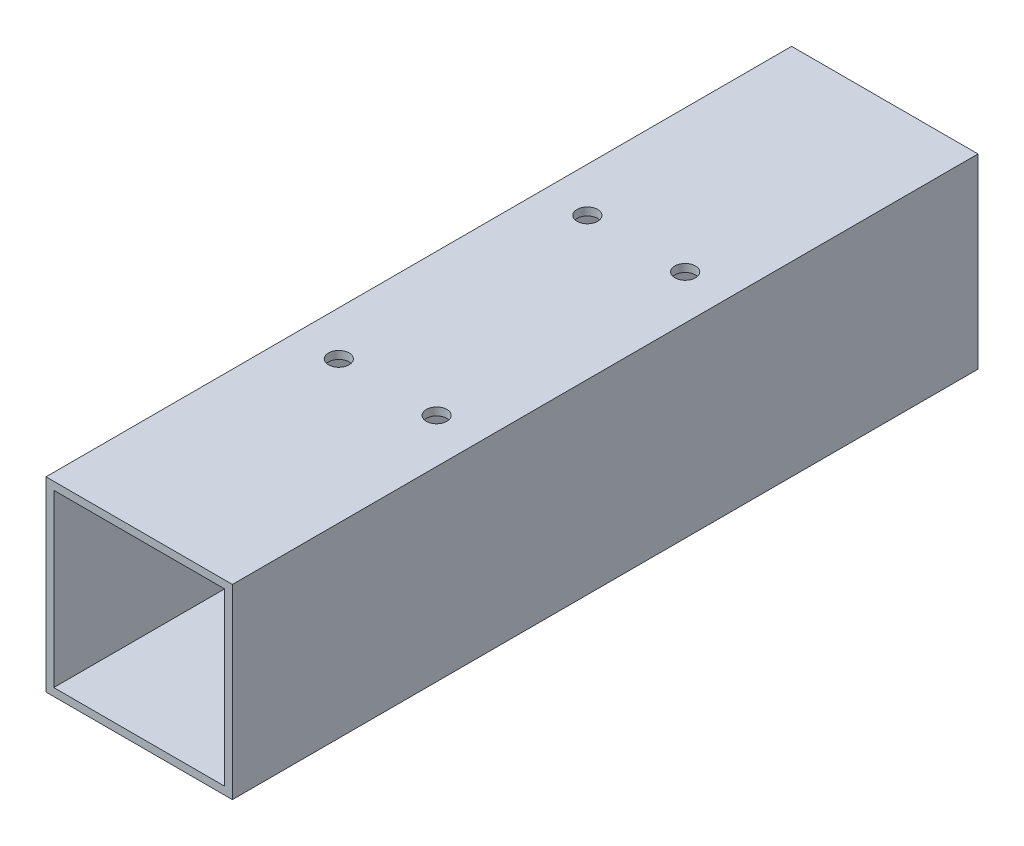
ISO-10303-21;
HEADER;
FILE_DESCRIPTION(('STEP AP214'),'2;1');
FILE_NAME('part.step','',(''),(''),'','','');
FILE_SCHEMA(('AUTOMOTIVE_DESIGN { 1 0 10303 214 1 1 1 1 }'));
ENDSEC;
DATA;
#1=APPLICATION_CONTEXT('core data for automotive mechanical design processes');
#2=APPLICATION_PROTOCOL_DEFINITION('international standard','automotive_design',2000,#1);
#3=PRODUCT_CONTEXT('',#1,'mechanical');
#4=PRODUCT('Part','Part','',(#3));
#5=PRODUCT_RELATED_PRODUCT_CATEGORY('part','',(#4));
#6=PRODUCT_DEFINITION_FORMATION('','',#4);
#7=PRODUCT_DEFINITION_CONTEXT('part definition',#1,'design');
#8=PRODUCT_DEFINITION('design','',#6,#7);
#9=PRODUCT_DEFINITION_SHAPE('','',#8);
#10=(LENGTH_UNIT() NAMED_UNIT(*) SI_UNIT(.MILLI.,.METRE.));
#11=(NAMED_UNIT(*) PLANE_ANGLE_UNIT() SI_UNIT($,.RADIAN.));
#12=(NAMED_UNIT(*) SI_UNIT($,.STERADIAN.) SOLID_ANGLE_UNIT());
#13=UNCERTAINTY_MEASURE_WITH_UNIT(LENGTH_MEASURE(1.E-05),#10,'distance_accuracy_value','');
#14=(GEOMETRIC_REPRESENTATION_CONTEXT(3) GLOBAL_UNCERTAINTY_ASSIGNED_CONTEXT((#13)) GLOBAL_UNIT_ASSIGNED_CONTEXT((#10,
#11,#12)) REPRESENTATION_CONTEXT('',''));
#15=CARTESIAN_POINT('',(0.,0.,0.));
#16=DIRECTION('',(0.,0.,1.));
#17=DIRECTION('',(1.,0.,0.));
#18=AXIS2_PLACEMENT_3D('',#15,#16,#17);
#19=CARTESIAN_POINT('',(-34.925,-34.925,152.4));
#20=DIRECTION('',(0.,1.,0.));
#21=DIRECTION('',(-1.,0.,0.));
#22=AXIS2_PLACEMENT_3D('',#19,#20,#21);
#23=PLANE('',#22);
#24=CARTESIAN_POINT('',(-20.,-34.925,-50.8));
#25=DIRECTION('',(0.,1.,0.));
#26=DIRECTION('',(-1.,0.,0.));
#27=AXIS2_PLACEMENT_3D('',#24,#25,#26);
#28=CIRCLE('',#27,6.74623999999999);
#29=CARTESIAN_POINT('',(-26.74624,-34.925,-50.8));
#30=VERTEX_POINT('',#29);
#31=EDGE_CURVE('E204',#30,#30,#28,.F.);
#32=ORIENTED_EDGE('',*,*,#31,.T.);
#33=EDGE_LOOP('',(#32));
#34=FACE_BOUND('',#33,.T.);
#35=CARTESIAN_POINT('',(20.,-34.925,50.8));
#36=DIRECTION('',(0.,1.,0.));
#37=DIRECTION('',(-1.,0.,0.));
#38=AXIS2_PLACEMENT_3D('',#35,#36,#37);
#39=CIRCLE('',#38,6.74623999999999);
#40=CARTESIAN_POINT('',(13.25376,-34.925,50.8));
#41=VERTEX_POINT('',#40);
#42=EDGE_CURVE('E198',#41,#41,#39,.F.);
#43=ORIENTED_EDGE('',*,*,#42,.T.);
#44=EDGE_LOOP('',(#43));
#45=FACE_BOUND('',#44,.T.);
#46=CARTESIAN_POINT('',(-20.,-34.925,50.8));
#47=DIRECTION('',(0.,1.,0.));
#48=DIRECTION('',(-1.,0.,0.));
#49=AXIS2_PLACEMENT_3D('',#46,#47,#48);
#50=CIRCLE('',#49,6.74623999999999);
#51=CARTESIAN_POINT('',(-26.74624,-34.925,50.8));
#52=VERTEX_POINT('',#51);
#53=EDGE_CURVE('E192',#52,#52,#50,.F.);
#54=ORIENTED_EDGE('',*,*,#53,.T.);
#55=EDGE_LOOP('',(#54));
#56=FACE_BOUND('',#55,.T.);
#57=DIRECTION('',(0.,0.,-1.));
#58=VECTOR('',#57,1.);
#59=CARTESIAN_POINT('',(34.9250000000001,-34.925,152.4));
#60=LINE('',#59,#58);
#61=CARTESIAN_POINT('',(34.9250000000001,-34.925,152.4));
#62=VERTEX_POINT('',#61);
#63=CARTESIAN_POINT('',(34.9250000000001,-34.925,-152.4));
#64=VERTEX_POINT('',#63);
#65=EDGE_CURVE('E116',#62,#64,#60,.T.);
#66=ORIENTED_EDGE('',*,*,#65,.T.);
#67=DIRECTION('',(1.,0.,0.));
#68=VECTOR('',#67,1.);
#69=CARTESIAN_POINT('',(-34.925,-34.925,-152.4));
#70=LINE('',#69,#68);
#71=CARTESIAN_POINT('',(-34.925,-34.925,-152.4));
#72=VERTEX_POINT('',#71);
#73=EDGE_CURVE('E119',#72,#64,#70,.T.);
#74=ORIENTED_EDGE('',*,*,#73,.F.);
#75=DIRECTION('',(0.,0.,-1.));
#76=VECTOR('',#75,1.);
#77=CARTESIAN_POINT('',(-34.925,-34.925,152.4));
#78=LINE('',#77,#76);
#79=CARTESIAN_POINT('',(-34.925,-34.925,152.4));
#80=VERTEX_POINT('',#79);
#81=EDGE_CURVE('E104',#80,#72,#78,.T.);
#82=ORIENTED_EDGE('',*,*,#81,.F.);
#83=DIRECTION('',(1.,0.,0.));
#84=VECTOR('',#83,1.);
#85=CARTESIAN_POINT('',(-34.925,-34.925,152.4));
#86=LINE('',#85,#84);
#87=EDGE_CURVE('E152',#80,#62,#86,.T.);
#88=ORIENTED_EDGE('',*,*,#87,.T.);
#89=EDGE_LOOP('',(#66,#74,#82,#88));
#90=FACE_BOUND('',#89,.T.);
#91=CARTESIAN_POINT('',(20.,-34.925,-50.8));
#92=DIRECTION('',(0.,1.,0.));
#93=DIRECTION('',(-1.,0.,0.));
#94=AXIS2_PLACEMENT_3D('',#91,#92,#93);
#95=CIRCLE('',#94,6.74623999999999);
#96=CARTESIAN_POINT('',(13.25376,-34.925,-50.8));
#97=VERTEX_POINT('',#96);
#98=EDGE_CURVE('E210',#97,#97,#95,.F.);
#99=ORIENTED_EDGE('',*,*,#98,.T.);
#100=EDGE_LOOP('',(#99));
#101=FACE_BOUND('',#100,.T.);
#102=ADVANCED_FACE('F37',(#34,#45,#56,#90,#101),#23,.T.);
#103=CARTESIAN_POINT('',(0.,0.,152.4));
#104=DIRECTION('',(0.,0.,1.));
#105=DIRECTION('',(1.,0.,0.));
#106=AXIS2_PLACEMENT_3D('',#103,#104,#105);
#107=PLANE('',#106);
#108=DIRECTION('',(0.,-1.,0.));
#109=VECTOR('',#108,1.);
#110=CARTESIAN_POINT('',(-38.1,38.1,152.4));
#111=LINE('',#110,#109);
#112=CARTESIAN_POINT('',(-38.1,38.1,152.4));
#113=VERTEX_POINT('',#112);
#114=CARTESIAN_POINT('',(-38.1,-38.1,152.4));
#115=VERTEX_POINT('',#114);
#116=EDGE_CURVE('E115',#113,#115,#111,.T.);
#117=ORIENTED_EDGE('',*,*,#116,.T.);
#118=DIRECTION('',(1.,0.,0.));
#119=VECTOR('',#118,1.);
#120=CARTESIAN_POINT('',(-38.1,-38.1,152.4));
#121=LINE('',#120,#119);
#122=CARTESIAN_POINT('',(38.1,-38.1,152.4));
#123=VERTEX_POINT('',#122);
#124=EDGE_CURVE('E163',#115,#123,#121,.T.);
#125=ORIENTED_EDGE('',*,*,#124,.T.);
#126=DIRECTION('',(0.,1.,0.));
#127=VECTOR('',#126,1.);
#128=CARTESIAN_POINT('',(38.1,-38.1,152.4));
#129=LINE('',#128,#127);
#130=CARTESIAN_POINT('',(38.1,38.1,152.4));
#131=VERTEX_POINT('',#130);
#132=EDGE_CURVE('E165',#123,#131,#129,.T.);
#133=ORIENTED_EDGE('',*,*,#132,.T.);
#134=DIRECTION('',(-1.,0.,0.));
#135=VECTOR('',#134,1.);
#136=CARTESIAN_POINT('',(38.1,38.1,152.4));
#137=LINE('',#136,#135);
#138=EDGE_CURVE('E62',#131,#113,#137,.T.);
#139=ORIENTED_EDGE('',*,*,#138,.T.);
#140=EDGE_LOOP('',(#117,#125,#133,#139));
#141=FACE_BOUND('',#140,.T.);
#142=ORIENTED_EDGE('',*,*,#87,.F.);
#143=DIRECTION('',(0.,-1.,0.));
#144=VECTOR('',#143,1.);
#145=CARTESIAN_POINT('',(-34.925,34.925,152.4));
#146=LINE('',#145,#144);
#147=CARTESIAN_POINT('',(-34.925,34.925,152.4));
#148=VERTEX_POINT('',#147);
#149=EDGE_CURVE('E112',#148,#80,#146,.T.);
#150=ORIENTED_EDGE('',*,*,#149,.F.);
#151=DIRECTION('',(-1.,0.,0.));
#152=VECTOR('',#151,1.);
#153=CARTESIAN_POINT('',(34.925,34.925,152.4));
#154=LINE('',#153,#152);
#155=CARTESIAN_POINT('',(34.925,34.925,152.4));
#156=VERTEX_POINT('',#155);
#157=EDGE_CURVE('E156',#156,#148,#154,.T.);
#158=ORIENTED_EDGE('',*,*,#157,.F.);
#159=DIRECTION('',(0.,1.,0.));
#160=VECTOR('',#159,1.);
#161=CARTESIAN_POINT('',(34.9250000000001,-34.925,152.4));
#162=LINE('',#161,#160);
#163=EDGE_CURVE('E154',#62,#156,#162,.T.);
#164=ORIENTED_EDGE('',*,*,#163,.F.);
#165=EDGE_LOOP('',(#142,#150,#158,#164));
#166=FACE_BOUND('',#165,.T.);
#167=ADVANCED_FACE('F242',(#141,#166),#107,.T.);
#168=CARTESIAN_POINT('',(-38.1,38.1,152.4));
#169=DIRECTION('',(1.,0.,0.));
#170=DIRECTION('',(0.,0.,-1.));
#171=AXIS2_PLACEMENT_3D('',#168,#169,#170);
#172=PLANE('',#171);
#173=DIRECTION('',(0.,0.,-1.));
#174=VECTOR('',#173,1.);
#175=CARTESIAN_POINT('',(-38.1,38.1,152.4));
#176=LINE('',#175,#174);
#177=CARTESIAN_POINT('',(-38.1,38.1,-152.4));
#178=VERTEX_POINT('',#177);
#179=EDGE_CURVE('E168',#113,#178,#176,.T.);
#180=ORIENTED_EDGE('',*,*,#179,.T.);
#181=DIRECTION('',(0.,-1.,0.));
#182=VECTOR('',#181,1.);
#183=CARTESIAN_POINT('',(-38.1,38.1,-152.4));
#184=LINE('',#183,#182);
#185=CARTESIAN_POINT('',(-38.1,-38.1,-152.4));
#186=VERTEX_POINT('',#185);
#187=EDGE_CURVE('E139',#178,#186,#184,.T.);
#188=ORIENTED_EDGE('',*,*,#187,.T.);
#189=DIRECTION('',(0.,0.,-1.));
#190=VECTOR('',#189,1.);
#191=CARTESIAN_POINT('',(-38.1,-38.1,152.4));
#192=LINE('',#191,#190);
#193=EDGE_CURVE('E11',#115,#186,#192,.T.);
#194=ORIENTED_EDGE('',*,*,#193,.F.);
#195=ORIENTED_EDGE('',*,*,#116,.F.);
#196=EDGE_LOOP('',(#180,#188,#194,#195));
#197=FACE_BOUND('',#196,.T.);
#198=ADVANCED_FACE('F39',(#197),#172,.F.);
#199=CARTESIAN_POINT('',(-38.1,-38.1,152.4));
#200=DIRECTION('',(0.,1.,0.));
#201=DIRECTION('',(0.,0.,1.));
#202=AXIS2_PLACEMENT_3D('',#199,#200,#201);
#203=PLANE('',#202);
#204=CARTESIAN_POINT('',(20.,-38.1,-50.8));
#205=DIRECTION('',(0.,-1.,0.));
#206=DIRECTION('',(0.,0.,-1.));
#207=AXIS2_PLACEMENT_3D('',#204,#205,#206);
#208=CIRCLE('',#207,6.74623999999999);
#209=CARTESIAN_POINT('',(20.,-38.1,-57.54624));
#210=VERTEX_POINT('',#209);
#211=EDGE_CURVE('E213',#210,#210,#208,.T.);
#212=ORIENTED_EDGE('',*,*,#211,.F.);
#213=EDGE_LOOP('',(#212));
#214=FACE_BOUND('',#213,.T.);
#215=CARTESIAN_POINT('',(-20.,-38.1,-50.8));
#216=DIRECTION('',(0.,-1.,0.));
#217=DIRECTION('',(0.,0.,-1.));
#218=AXIS2_PLACEMENT_3D('',#215,#216,#217);
#219=CIRCLE('',#218,6.74623999999999);
#220=CARTESIAN_POINT('',(-20.,-38.1,-57.54624));
#221=VERTEX_POINT('',#220);
#222=EDGE_CURVE('E207',#221,#221,#219,.T.);
#223=ORIENTED_EDGE('',*,*,#222,.F.);
#224=EDGE_LOOP('',(#223));
#225=FACE_BOUND('',#224,.T.);
#226=CARTESIAN_POINT('',(20.,-38.1,50.8));
#227=DIRECTION('',(0.,-1.,0.));
#228=DIRECTION('',(0.,0.,-1.));
#229=AXIS2_PLACEMENT_3D('',#226,#227,#228);
#230=CIRCLE('',#229,6.74623999999999);
#231=CARTESIAN_POINT('',(20.,-38.1,44.05376));
#232=VERTEX_POINT('',#231);
#233=EDGE_CURVE('E201',#232,#232,#230,.T.);
#234=ORIENTED_EDGE('',*,*,#233,.F.);
#235=EDGE_LOOP('',(#234));
#236=FACE_BOUND('',#235,.T.);
#237=CARTESIAN_POINT('',(-20.,-38.1,50.8));
#238=DIRECTION('',(0.,-1.,0.));
#239=DIRECTION('',(0.,0.,-1.));
#240=AXIS2_PLACEMENT_3D('',#237,#238,#239);
#241=CIRCLE('',#240,6.74623999999999);
#242=CARTESIAN_POINT('',(-20.,-38.1,44.05376));
#243=VERTEX_POINT('',#242);
#244=EDGE_CURVE('E195',#243,#243,#241,.T.);
#245=ORIENTED_EDGE('',*,*,#244,.F.);
#246=EDGE_LOOP('',(#245));
#247=FACE_BOUND('',#246,.T.);
#248=ORIENTED_EDGE('',*,*,#193,.T.);
#249=DIRECTION('',(1.,0.,0.));
#250=VECTOR('',#249,1.);
#251=CARTESIAN_POINT('',(-38.1,-38.1,-152.4));
#252=LINE('',#251,#250);
#253=CARTESIAN_POINT('',(38.1,-38.1,-152.4));
#254=VERTEX_POINT('',#253);
#255=EDGE_CURVE('E142',#186,#254,#252,.T.);
#256=ORIENTED_EDGE('',*,*,#255,.T.);
#257=DIRECTION('',(0.,0.,-1.));
#258=VECTOR('',#257,1.);
#259=CARTESIAN_POINT('',(38.1,-38.1,152.4));
#260=LINE('',#259,#258);
#261=EDGE_CURVE('E46',#123,#254,#260,.T.);
#262=ORIENTED_EDGE('',*,*,#261,.F.);
#263=ORIENTED_EDGE('',*,*,#124,.F.);
#264=EDGE_LOOP('',(#248,#256,#262,#263));
#265=FACE_BOUND('',#264,.T.);
#266=ADVANCED_FACE('F219',(#214,#225,#236,#247,#265),#203,.F.);
#267=CARTESIAN_POINT('',(38.1,-38.1,152.4));
#268=DIRECTION('',(-1.,0.,0.));
#269=DIRECTION('',(0.,0.,1.));
#270=AXIS2_PLACEMENT_3D('',#267,#268,#269);
#271=PLANE('',#270);
#272=ORIENTED_EDGE('',*,*,#261,.T.);
#273=DIRECTION('',(0.,1.,0.));
#274=VECTOR('',#273,1.);
#275=CARTESIAN_POINT('',(38.1,-38.1,-152.4));
#276=LINE('',#275,#274);
#277=CARTESIAN_POINT('',(38.1,38.1,-152.4));
#278=VERTEX_POINT('',#277);
#279=EDGE_CURVE('E145',#254,#278,#276,.T.);
#280=ORIENTED_EDGE('',*,*,#279,.T.);
#281=DIRECTION('',(0.,0.,-1.));
#282=VECTOR('',#281,1.);
#283=CARTESIAN_POINT('',(38.1,38.1,152.4));
#284=LINE('',#283,#282);
#285=EDGE_CURVE('E170',#131,#278,#284,.T.);
#286=ORIENTED_EDGE('',*,*,#285,.F.);
#287=ORIENTED_EDGE('',*,*,#132,.F.);
#288=EDGE_LOOP('',(#272,#280,#286,#287));
#289=FACE_BOUND('',#288,.T.);
#290=ADVANCED_FACE('F222',(#289),#271,.F.);
#291=CARTESIAN_POINT('',(38.1,38.1,152.4));
#292=DIRECTION('',(0.,-1.,0.));
#293=DIRECTION('',(1.,0.,0.));
#294=AXIS2_PLACEMENT_3D('',#291,#292,#293);
#295=PLANE('',#294);
#296=CARTESIAN_POINT('',(-20.,38.1,-50.8));
#297=DIRECTION('',(0.,-1.,0.));
#298=DIRECTION('',(0.,0.,-1.));
#299=AXIS2_PLACEMENT_3D('',#296,#297,#298);
#300=CIRCLE('',#299,4.21639999999999);
#301=CARTESIAN_POINT('',(-20.,38.1,-55.0164));
#302=VERTEX_POINT('',#301);
#303=EDGE_CURVE('E189',#302,#302,#300,.T.);
#304=ORIENTED_EDGE('',*,*,#303,.T.);
#305=EDGE_LOOP('',(#304));
#306=FACE_BOUND('',#305,.T.);
#307=CARTESIAN_POINT('',(20.,38.1,50.8));
#308=DIRECTION('',(0.,-1.,0.));
#309=DIRECTION('',(0.,0.,-1.));
#310=AXIS2_PLACEMENT_3D('',#307,#308,#309);
#311=CIRCLE('',#310,4.21639999999999);
#312=CARTESIAN_POINT('',(20.,38.1,46.5836));
#313=VERTEX_POINT('',#312);
#314=EDGE_CURVE('E184',#313,#313,#311,.T.);
#315=ORIENTED_EDGE('',*,*,#314,.T.);
#316=EDGE_LOOP('',(#315));
#317=FACE_BOUND('',#316,.T.);
#318=CARTESIAN_POINT('',(20.,38.1,-50.8));
#319=DIRECTION('',(0.,-1.,0.));
#320=DIRECTION('',(0.,0.,-1.));
#321=AXIS2_PLACEMENT_3D('',#318,#319,#320);
#322=CIRCLE('',#321,4.21639999999999);
#323=CARTESIAN_POINT('',(20.,38.1,-55.0164));
#324=VERTEX_POINT('',#323);
#325=EDGE_CURVE('E174',#324,#324,#322,.T.);
#326=ORIENTED_EDGE('',*,*,#325,.T.);
#327=EDGE_LOOP('',(#326));
#328=FACE_BOUND('',#327,.T.);
#329=CARTESIAN_POINT('',(-20.,38.1,50.8));
#330=DIRECTION('',(0.,-1.,0.));
#331=DIRECTION('',(0.,0.,-1.));
#332=AXIS2_PLACEMENT_3D('',#329,#330,#331);
#333=CIRCLE('',#332,4.21639999999999);
#334=CARTESIAN_POINT('',(-20.,38.1,46.5836));
#335=VERTEX_POINT('',#334);
#336=EDGE_CURVE('E133',#335,#335,#333,.T.);
#337=ORIENTED_EDGE('',*,*,#336,.T.);
#338=EDGE_LOOP('',(#337));
#339=FACE_BOUND('',#338,.T.);
#340=ORIENTED_EDGE('',*,*,#285,.T.);
#341=DIRECTION('',(-1.,0.,0.));
#342=VECTOR('',#341,1.);
#343=CARTESIAN_POINT('',(38.1,38.1,-152.4));
#344=LINE('',#343,#342);
#345=EDGE_CURVE('E148',#278,#178,#344,.T.);
#346=ORIENTED_EDGE('',*,*,#345,.T.);
#347=ORIENTED_EDGE('',*,*,#179,.F.);
#348=ORIENTED_EDGE('',*,*,#138,.F.);
#349=EDGE_LOOP('',(#340,#346,#347,#348));
#350=FACE_BOUND('',#349,.T.);
#351=ADVANCED_FACE('F238',(#306,#317,#328,#339,#350),#295,.F.);
#352=CARTESIAN_POINT('',(-34.925,34.925,152.4));
#353=DIRECTION('',(1.,0.,0.));
#354=DIRECTION('',(0.,1.,0.));
#355=AXIS2_PLACEMENT_3D('',#352,#353,#354);
#356=PLANE('',#355);
#357=ORIENTED_EDGE('',*,*,#81,.T.);
#358=DIRECTION('',(0.,-1.,0.));
#359=VECTOR('',#358,1.);
#360=CARTESIAN_POINT('',(-34.925,34.925,-152.4));
#361=LINE('',#360,#359);
#362=CARTESIAN_POINT('',(-34.925,34.925,-152.4));
#363=VERTEX_POINT('',#362);
#364=EDGE_CURVE('E109',#363,#72,#361,.T.);
#365=ORIENTED_EDGE('',*,*,#364,.F.);
#366=DIRECTION('',(0.,0.,-1.));
#367=VECTOR('',#366,1.);
#368=CARTESIAN_POINT('',(-34.925,34.925,152.4));
#369=LINE('',#368,#367);
#370=EDGE_CURVE('E158',#148,#363,#369,.T.);
#371=ORIENTED_EDGE('',*,*,#370,.F.);
#372=ORIENTED_EDGE('',*,*,#149,.T.);
#373=EDGE_LOOP('',(#357,#365,#371,#372));
#374=FACE_BOUND('',#373,.T.);
#375=ADVANCED_FACE('F106',(#374),#356,.T.);
#376=CARTESIAN_POINT('',(34.9250000000001,-34.925,152.4));
#377=DIRECTION('',(-1.,0.,0.));
#378=DIRECTION('',(0.,-1.,0.));
#379=AXIS2_PLACEMENT_3D('',#376,#377,#378);
#380=PLANE('',#379);
#381=DIRECTION('',(0.,0.,-1.));
#382=VECTOR('',#381,1.);
#383=CARTESIAN_POINT('',(34.925,34.925,152.4));
#384=LINE('',#383,#382);
#385=CARTESIAN_POINT('',(34.925,34.925,-152.4));
#386=VERTEX_POINT('',#385);
#387=EDGE_CURVE('E54',#156,#386,#384,.T.);
#388=ORIENTED_EDGE('',*,*,#387,.T.);
#389=DIRECTION('',(0.,1.,0.));
#390=VECTOR('',#389,1.);
#391=CARTESIAN_POINT('',(34.9250000000001,-34.925,-152.4));
#392=LINE('',#391,#390);
#393=EDGE_CURVE('E125',#64,#386,#392,.T.);
#394=ORIENTED_EDGE('',*,*,#393,.F.);
#395=ORIENTED_EDGE('',*,*,#65,.F.);
#396=ORIENTED_EDGE('',*,*,#163,.T.);
#397=EDGE_LOOP('',(#388,#394,#395,#396));
#398=FACE_BOUND('',#397,.T.);
#399=ADVANCED_FACE('F249',(#398),#380,.T.);
#400=CARTESIAN_POINT('',(34.925,34.925,152.4));
#401=DIRECTION('',(0.,-1.,0.));
#402=DIRECTION('',(0.,0.,-1.));
#403=AXIS2_PLACEMENT_3D('',#400,#401,#402);
#404=PLANE('',#403);
#405=CARTESIAN_POINT('',(-20.,34.925,-50.8));
#406=DIRECTION('',(0.,-1.,0.));
#407=DIRECTION('',(0.,0.,-1.));
#408=AXIS2_PLACEMENT_3D('',#405,#406,#407);
#409=CIRCLE('',#408,4.21639999999999);
#410=CARTESIAN_POINT('',(-20.,34.925,-55.0164));
#411=VERTEX_POINT('',#410);
#412=EDGE_CURVE('E41',#411,#411,#409,.T.);
#413=ORIENTED_EDGE('',*,*,#412,.F.);
#414=EDGE_LOOP('',(#413));
#415=FACE_BOUND('',#414,.T.);
#416=CARTESIAN_POINT('',(20.,34.925,50.8));
#417=DIRECTION('',(0.,-1.,0.));
#418=DIRECTION('',(0.,0.,-1.));
#419=AXIS2_PLACEMENT_3D('',#416,#417,#418);
#420=CIRCLE('',#419,4.21639999999999);
#421=CARTESIAN_POINT('',(20.,34.925,46.5836));
#422=VERTEX_POINT('',#421);
#423=EDGE_CURVE('E179',#422,#422,#420,.T.);
#424=ORIENTED_EDGE('',*,*,#423,.F.);
#425=EDGE_LOOP('',(#424));
#426=FACE_BOUND('',#425,.T.);
#427=CARTESIAN_POINT('',(20.,34.925,-50.8));
#428=DIRECTION('',(0.,-1.,0.));
#429=DIRECTION('',(0.,0.,-1.));
#430=AXIS2_PLACEMENT_3D('',#427,#428,#429);
#431=CIRCLE('',#430,4.21639999999999);
#432=CARTESIAN_POINT('',(20.,34.925,-55.0164));
#433=VERTEX_POINT('',#432);
#434=EDGE_CURVE('E172',#433,#433,#431,.T.);
#435=ORIENTED_EDGE('',*,*,#434,.F.);
#436=EDGE_LOOP('',(#435));
#437=FACE_BOUND('',#436,.T.);
#438=CARTESIAN_POINT('',(-20.,34.925,50.8));
#439=DIRECTION('',(0.,-1.,0.));
#440=DIRECTION('',(0.,0.,-1.));
#441=AXIS2_PLACEMENT_3D('',#438,#439,#440);
#442=CIRCLE('',#441,4.21639999999999);
#443=CARTESIAN_POINT('',(-20.,34.925,46.5836));
#444=VERTEX_POINT('',#443);
#445=EDGE_CURVE('E130',#444,#444,#442,.T.);
#446=ORIENTED_EDGE('',*,*,#445,.F.);
#447=EDGE_LOOP('',(#446));
#448=FACE_BOUND('',#447,.T.);
#449=ORIENTED_EDGE('',*,*,#370,.T.);
#450=DIRECTION('',(-1.,0.,0.));
#451=VECTOR('',#450,1.);
#452=CARTESIAN_POINT('',(34.925,34.925,-152.4));
#453=LINE('',#452,#451);
#454=EDGE_CURVE('E129',#386,#363,#453,.T.);
#455=ORIENTED_EDGE('',*,*,#454,.F.);
#456=ORIENTED_EDGE('',*,*,#387,.F.);
#457=ORIENTED_EDGE('',*,*,#157,.T.);
#458=EDGE_LOOP('',(#449,#455,#456,#457));
#459=FACE_BOUND('',#458,.T.);
#460=ADVANCED_FACE('F250',(#415,#426,#437,#448,#459),#404,.T.);
#461=CARTESIAN_POINT('',(0.,0.,-152.4));
#462=DIRECTION('',(0.,0.,1.));
#463=DIRECTION('',(1.,0.,0.));
#464=AXIS2_PLACEMENT_3D('',#461,#462,#463);
#465=PLANE('',#464);
#466=ORIENTED_EDGE('',*,*,#454,.T.);
#467=ORIENTED_EDGE('',*,*,#364,.T.);
#468=ORIENTED_EDGE('',*,*,#73,.T.);
#469=ORIENTED_EDGE('',*,*,#393,.T.);
#470=EDGE_LOOP('',(#466,#467,#468,#469));
#471=FACE_BOUND('',#470,.T.);
#472=ORIENTED_EDGE('',*,*,#187,.F.);
#473=ORIENTED_EDGE('',*,*,#345,.F.);
#474=ORIENTED_EDGE('',*,*,#279,.F.);
#475=ORIENTED_EDGE('',*,*,#255,.F.);
#476=EDGE_LOOP('',(#472,#473,#474,#475));
#477=FACE_BOUND('',#476,.T.);
#478=ADVANCED_FACE('F127',(#471,#477),#465,.F.);
#479=CARTESIAN_POINT('',(-20.,-38.1,50.8));
#480=DIRECTION('',(0.,-1.,0.));
#481=DIRECTION('',(0.,0.,-1.));
#482=AXIS2_PLACEMENT_3D('',#479,#480,#481);
#483=CYLINDRICAL_SURFACE('',#482,4.21639999999999);
#484=ORIENTED_EDGE('',*,*,#445,.T.);
#485=EDGE_LOOP('',(#484));
#486=FACE_BOUND('',#485,.T.);
#487=ORIENTED_EDGE('',*,*,#336,.F.);
#488=EDGE_LOOP('',(#487));
#489=FACE_BOUND('',#488,.T.);
#490=ADVANCED_FACE('F258',(#486,#489),#483,.F.);
#491=CARTESIAN_POINT('',(20.,-38.1,-50.8));
#492=DIRECTION('',(0.,-1.,0.));
#493=DIRECTION('',(0.,0.,-1.));
#494=AXIS2_PLACEMENT_3D('',#491,#492,#493);
#495=CYLINDRICAL_SURFACE('',#494,4.21639999999999);
#496=ORIENTED_EDGE('',*,*,#434,.T.);
#497=EDGE_LOOP('',(#496));
#498=FACE_BOUND('',#497,.T.);
#499=ORIENTED_EDGE('',*,*,#325,.F.);
#500=EDGE_LOOP('',(#499));
#501=FACE_BOUND('',#500,.T.);
#502=ADVANCED_FACE('F312',(#498,#501),#495,.F.);
#503=CARTESIAN_POINT('',(20.,-38.1,50.8));
#504=DIRECTION('',(0.,-1.,0.));
#505=DIRECTION('',(0.,0.,-1.));
#506=AXIS2_PLACEMENT_3D('',#503,#504,#505);
#507=CYLINDRICAL_SURFACE('',#506,4.21639999999999);
#508=ORIENTED_EDGE('',*,*,#423,.T.);
#509=EDGE_LOOP('',(#508));
#510=FACE_BOUND('',#509,.T.);
#511=ORIENTED_EDGE('',*,*,#314,.F.);
#512=EDGE_LOOP('',(#511));
#513=FACE_BOUND('',#512,.T.);
#514=ADVANCED_FACE('F319',(#510,#513),#507,.F.);
#515=CARTESIAN_POINT('',(-20.,-38.1,-50.8));
#516=DIRECTION('',(0.,-1.,0.));
#517=DIRECTION('',(0.,0.,-1.));
#518=AXIS2_PLACEMENT_3D('',#515,#516,#517);
#519=CYLINDRICAL_SURFACE('',#518,4.21639999999999);
#520=ORIENTED_EDGE('',*,*,#412,.T.);
#521=EDGE_LOOP('',(#520));
#522=FACE_BOUND('',#521,.T.);
#523=ORIENTED_EDGE('',*,*,#303,.F.);
#524=EDGE_LOOP('',(#523));
#525=FACE_BOUND('',#524,.T.);
#526=ADVANCED_FACE('F326',(#522,#525),#519,.F.);
#527=CARTESIAN_POINT('',(-20.,-38.1,50.8));
#528=DIRECTION('',(0.,-1.,0.));
#529=DIRECTION('',(0.,0.,-1.));
#530=AXIS2_PLACEMENT_3D('',#527,#528,#529);
#531=CYLINDRICAL_SURFACE('',#530,6.74623999999999);
#532=ORIENTED_EDGE('',*,*,#53,.F.);
#533=EDGE_LOOP('',(#532));
#534=FACE_BOUND('',#533,.T.);
#535=ORIENTED_EDGE('',*,*,#244,.T.);
#536=EDGE_LOOP('',(#535));
#537=FACE_BOUND('',#536,.T.);
#538=ADVANCED_FACE('F334',(#534,#537),#531,.F.);
#539=CARTESIAN_POINT('',(20.,-38.1,50.8));
#540=DIRECTION('',(0.,-1.,0.));
#541=DIRECTION('',(0.,0.,-1.));
#542=AXIS2_PLACEMENT_3D('',#539,#540,#541);
#543=CYLINDRICAL_SURFACE('',#542,6.74623999999999);
#544=ORIENTED_EDGE('',*,*,#42,.F.);
#545=EDGE_LOOP('',(#544));
#546=FACE_BOUND('',#545,.T.);
#547=ORIENTED_EDGE('',*,*,#233,.T.);
#548=EDGE_LOOP('',(#547));
#549=FACE_BOUND('',#548,.T.);
#550=ADVANCED_FACE('F342',(#546,#549),#543,.F.);
#551=CARTESIAN_POINT('',(-20.,-38.1,-50.8));
#552=DIRECTION('',(0.,-1.,0.));
#553=DIRECTION('',(0.,0.,-1.));
#554=AXIS2_PLACEMENT_3D('',#551,#552,#553);
#555=CYLINDRICAL_SURFACE('',#554,6.74623999999999);
#556=ORIENTED_EDGE('',*,*,#31,.F.);
#557=EDGE_LOOP('',(#556));
#558=FACE_BOUND('',#557,.T.);
#559=ORIENTED_EDGE('',*,*,#222,.T.);
#560=EDGE_LOOP('',(#559));
#561=FACE_BOUND('',#560,.T.);
#562=ADVANCED_FACE('F350',(#558,#561),#555,.F.);
#563=CARTESIAN_POINT('',(20.,-38.1,-50.8));
#564=DIRECTION('',(0.,-1.,0.));
#565=DIRECTION('',(0.,0.,-1.));
#566=AXIS2_PLACEMENT_3D('',#563,#564,#565);
#567=CYLINDRICAL_SURFACE('',#566,6.74623999999999);
#568=ORIENTED_EDGE('',*,*,#98,.F.);
#569=EDGE_LOOP('',(#568));
#570=FACE_BOUND('',#569,.T.);
#571=ORIENTED_EDGE('',*,*,#211,.T.);
#572=EDGE_LOOP('',(#571));
#573=FACE_BOUND('',#572,.T.);
#574=ADVANCED_FACE('F217',(#570,#573),#567,.F.);
#575=CLOSED_SHELL('',(#102,#167,#198,#266,#290,#351,#375,#399,#460,#478,#490,#502,#514,#526,
#538,#550,#562,#574));
#576=MANIFOLD_SOLID_BREP('B2',#575);
#577=ADVANCED_BREP_SHAPE_REPRESENTATION('',(#18,#576),#14);
#578=SHAPE_DEFINITION_REPRESENTATION(#9,#577);
ENDSEC;
END-ISO-10303-21;
